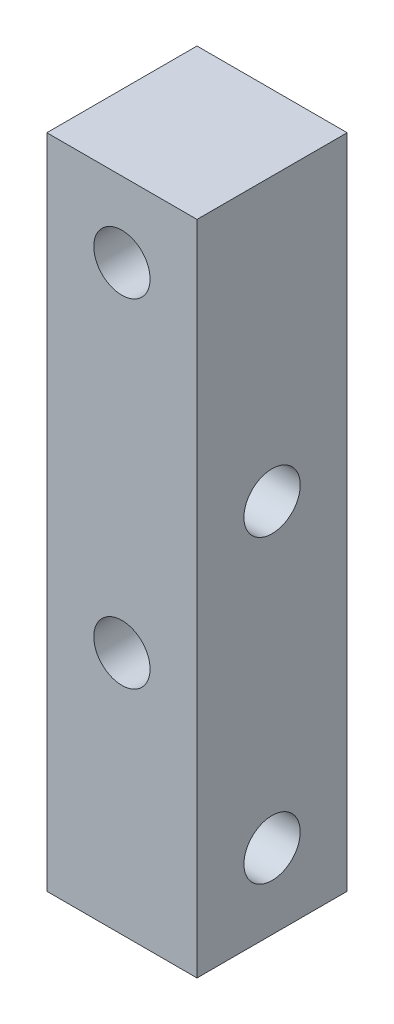
ISO-10303-21;
HEADER;
FILE_DESCRIPTION(('STEP AP214'),'2;1');
FILE_NAME('part.step','',(''),(''),'','','');
FILE_SCHEMA(('AUTOMOTIVE_DESIGN { 1 0 10303 214 1 1 1 1 }'));
ENDSEC;
DATA;
#1=APPLICATION_CONTEXT('core data for automotive mechanical design processes');
#2=APPLICATION_PROTOCOL_DEFINITION('international standard','automotive_design',2000,#1);
#3=PRODUCT_CONTEXT('',#1,'mechanical');
#4=PRODUCT('Part','Part','',(#3));
#5=PRODUCT_RELATED_PRODUCT_CATEGORY('part','',(#4));
#6=PRODUCT_DEFINITION_FORMATION('','',#4);
#7=PRODUCT_DEFINITION_CONTEXT('part definition',#1,'design');
#8=PRODUCT_DEFINITION('design','',#6,#7);
#9=PRODUCT_DEFINITION_SHAPE('','',#8);
#10=(LENGTH_UNIT() NAMED_UNIT(*) SI_UNIT(.MILLI.,.METRE.));
#11=(NAMED_UNIT(*) PLANE_ANGLE_UNIT() SI_UNIT($,.RADIAN.));
#12=(NAMED_UNIT(*) SI_UNIT($,.STERADIAN.) SOLID_ANGLE_UNIT());
#13=UNCERTAINTY_MEASURE_WITH_UNIT(LENGTH_MEASURE(1.E-05),#10,'distance_accuracy_value','');
#14=(GEOMETRIC_REPRESENTATION_CONTEXT(3) GLOBAL_UNCERTAINTY_ASSIGNED_CONTEXT((#13)) GLOBAL_UNIT_ASSIGNED_CONTEXT((#10,
#11,#12)) REPRESENTATION_CONTEXT('',''));
#15=CARTESIAN_POINT('',(0.,0.,0.));
#16=DIRECTION('',(0.,0.,1.));
#17=DIRECTION('',(1.,0.,0.));
#18=AXIS2_PLACEMENT_3D('',#15,#16,#17);
#19=CARTESIAN_POINT('',(4.,35.,-4.));
#20=DIRECTION('',(-1.,0.,0.));
#21=DIRECTION('',(0.,0.,1.));
#22=AXIS2_PLACEMENT_3D('',#19,#20,#21);
#23=PLANE('',#22);
#24=CARTESIAN_POINT('',(4.,20.,0.));
#25=DIRECTION('',(1.,0.,0.));
#26=DIRECTION('',(0.,0.,-1.));
#27=AXIS2_PLACEMENT_3D('',#24,#25,#26);
#28=CIRCLE('',#27,1.5);
#29=CARTESIAN_POINT('',(4.,20.,-1.5));
#30=VERTEX_POINT('',#29);
#31=EDGE_CURVE('E140',#30,#30,#28,.T.);
#32=ORIENTED_EDGE('',*,*,#31,.F.);
#33=EDGE_LOOP('',(#32));
#34=FACE_BOUND('',#33,.T.);
#35=CARTESIAN_POINT('',(4.,4.,0.));
#36=DIRECTION('',(1.,0.,0.));
#37=DIRECTION('',(0.,0.,-1.));
#38=AXIS2_PLACEMENT_3D('',#35,#36,#37);
#39=CIRCLE('',#38,1.5);
#40=CARTESIAN_POINT('',(4.,4.,-1.5));
#41=VERTEX_POINT('',#40);
#42=EDGE_CURVE('E134',#41,#41,#39,.T.);
#43=ORIENTED_EDGE('',*,*,#42,.F.);
#44=EDGE_LOOP('',(#43));
#45=FACE_BOUND('',#44,.T.);
#46=DIRECTION('',(0.,0.,-1.));
#47=VECTOR('',#46,1.);
#48=CARTESIAN_POINT('',(4.,0.,-4.));
#49=LINE('',#48,#47);
#50=CARTESIAN_POINT('',(4.,0.,4.));
#51=VERTEX_POINT('',#50);
#52=CARTESIAN_POINT('',(4.,0.,-4.));
#53=VERTEX_POINT('',#52);
#54=EDGE_CURVE('E108',#51,#53,#49,.T.);
#55=ORIENTED_EDGE('',*,*,#54,.T.);
#56=DIRECTION('',(0.,-1.,0.));
#57=VECTOR('',#56,1.);
#58=CARTESIAN_POINT('',(4.,35.,-4.));
#59=LINE('',#58,#57);
#60=CARTESIAN_POINT('',(4.,35.,-4.));
#61=VERTEX_POINT('',#60);
#62=EDGE_CURVE('E13',#61,#53,#59,.T.);
#63=ORIENTED_EDGE('',*,*,#62,.F.);
#64=DIRECTION('',(0.,0.,-1.));
#65=VECTOR('',#64,1.);
#66=CARTESIAN_POINT('',(4.,35.,-4.));
#67=LINE('',#66,#65);
#68=CARTESIAN_POINT('',(4.,35.,4.));
#69=VERTEX_POINT('',#68);
#70=EDGE_CURVE('E96',#69,#61,#67,.T.);
#71=ORIENTED_EDGE('',*,*,#70,.F.);
#72=DIRECTION('',(0.,-1.,0.));
#73=VECTOR('',#72,1.);
#74=CARTESIAN_POINT('',(4.,35.,4.));
#75=LINE('',#74,#73);
#76=EDGE_CURVE('E104',#69,#51,#75,.T.);
#77=ORIENTED_EDGE('',*,*,#76,.T.);
#78=EDGE_LOOP('',(#55,#63,#71,#77));
#79=FACE_BOUND('',#78,.T.);
#80=ADVANCED_FACE('F45',(#34,#45,#79),#23,.F.);
#81=CARTESIAN_POINT('',(-4.,35.,-4.));
#82=DIRECTION('',(0.,0.,1.));
#83=DIRECTION('',(1.,0.,0.));
#84=AXIS2_PLACEMENT_3D('',#81,#82,#83);
#85=PLANE('',#84);
#86=CARTESIAN_POINT('',(0.,31.,-4.));
#87=DIRECTION('',(0.,0.,-1.));
#88=DIRECTION('',(-1.,0.,0.));
#89=AXIS2_PLACEMENT_3D('',#86,#87,#88);
#90=CIRCLE('',#89,1.5);
#91=CARTESIAN_POINT('',(-1.5,31.,-4.));
#92=VERTEX_POINT('',#91);
#93=EDGE_CURVE('E129',#92,#92,#90,.T.);
#94=ORIENTED_EDGE('',*,*,#93,.F.);
#95=EDGE_LOOP('',(#94));
#96=FACE_BOUND('',#95,.T.);
#97=CARTESIAN_POINT('',(0.,13.,-4.));
#98=DIRECTION('',(0.,0.,-1.));
#99=DIRECTION('',(-1.,0.,0.));
#100=AXIS2_PLACEMENT_3D('',#97,#98,#99);
#101=CIRCLE('',#100,1.5);
#102=CARTESIAN_POINT('',(-1.5,13.,-4.));
#103=VERTEX_POINT('',#102);
#104=EDGE_CURVE('E122',#103,#103,#101,.T.);
#105=ORIENTED_EDGE('',*,*,#104,.F.);
#106=EDGE_LOOP('',(#105));
#107=FACE_BOUND('',#106,.T.);
#108=DIRECTION('',(-1.,0.,0.));
#109=VECTOR('',#108,1.);
#110=CARTESIAN_POINT('',(-4.,0.,-4.));
#111=LINE('',#110,#109);
#112=CARTESIAN_POINT('',(-4.,0.,-4.));
#113=VERTEX_POINT('',#112);
#114=EDGE_CURVE('E100',#53,#113,#111,.T.);
#115=ORIENTED_EDGE('',*,*,#114,.T.);
#116=DIRECTION('',(0.,-1.,0.));
#117=VECTOR('',#116,1.);
#118=CARTESIAN_POINT('',(-4.,35.,-4.));
#119=LINE('',#118,#117);
#120=CARTESIAN_POINT('',(-4.,35.,-4.));
#121=VERTEX_POINT('',#120);
#122=EDGE_CURVE('E53',#121,#113,#119,.T.);
#123=ORIENTED_EDGE('',*,*,#122,.F.);
#124=DIRECTION('',(-1.,0.,0.));
#125=VECTOR('',#124,1.);
#126=CARTESIAN_POINT('',(-4.,35.,-4.));
#127=LINE('',#126,#125);
#128=EDGE_CURVE('E91',#61,#121,#127,.T.);
#129=ORIENTED_EDGE('',*,*,#128,.F.);
#130=ORIENTED_EDGE('',*,*,#62,.T.);
#131=EDGE_LOOP('',(#115,#123,#129,#130));
#132=FACE_BOUND('',#131,.T.);
#133=ADVANCED_FACE('F99',(#96,#107,#132),#85,.F.);
#134=CARTESIAN_POINT('',(-4.,35.,-4.));
#135=DIRECTION('',(1.,0.,0.));
#136=DIRECTION('',(0.,0.,-1.));
#137=AXIS2_PLACEMENT_3D('',#134,#135,#136);
#138=PLANE('',#137);
#139=CARTESIAN_POINT('',(-4.,20.,0.));
#140=DIRECTION('',(1.,0.,0.));
#141=DIRECTION('',(0.,0.,-1.));
#142=AXIS2_PLACEMENT_3D('',#139,#140,#141);
#143=CIRCLE('',#142,1.5);
#144=CARTESIAN_POINT('',(-4.,20.,-1.5));
#145=VERTEX_POINT('',#144);
#146=EDGE_CURVE('E126',#145,#145,#143,.T.);
#147=ORIENTED_EDGE('',*,*,#146,.T.);
#148=EDGE_LOOP('',(#147));
#149=FACE_BOUND('',#148,.T.);
#150=CARTESIAN_POINT('',(-4.,4.,0.));
#151=DIRECTION('',(1.,0.,0.));
#152=DIRECTION('',(0.,0.,-1.));
#153=AXIS2_PLACEMENT_3D('',#150,#151,#152);
#154=CIRCLE('',#153,1.5);
#155=CARTESIAN_POINT('',(-4.,4.,-1.5));
#156=VERTEX_POINT('',#155);
#157=EDGE_CURVE('E137',#156,#156,#154,.T.);
#158=ORIENTED_EDGE('',*,*,#157,.T.);
#159=EDGE_LOOP('',(#158));
#160=FACE_BOUND('',#159,.T.);
#161=DIRECTION('',(0.,0.,1.));
#162=VECTOR('',#161,1.);
#163=CARTESIAN_POINT('',(-4.,0.,-4.));
#164=LINE('',#163,#162);
#165=CARTESIAN_POINT('',(-4.,0.,4.));
#166=VERTEX_POINT('',#165);
#167=EDGE_CURVE('E78',#113,#166,#164,.T.);
#168=ORIENTED_EDGE('',*,*,#167,.T.);
#169=DIRECTION('',(0.,-1.,0.));
#170=VECTOR('',#169,1.);
#171=CARTESIAN_POINT('',(-4.,35.,4.));
#172=LINE('',#171,#170);
#173=CARTESIAN_POINT('',(-4.,35.,4.));
#174=VERTEX_POINT('',#173);
#175=EDGE_CURVE('E101',#174,#166,#172,.T.);
#176=ORIENTED_EDGE('',*,*,#175,.F.);
#177=DIRECTION('',(0.,0.,1.));
#178=VECTOR('',#177,1.);
#179=CARTESIAN_POINT('',(-4.,35.,-4.));
#180=LINE('',#179,#178);
#181=EDGE_CURVE('E94',#121,#174,#180,.T.);
#182=ORIENTED_EDGE('',*,*,#181,.F.);
#183=ORIENTED_EDGE('',*,*,#122,.T.);
#184=EDGE_LOOP('',(#168,#176,#182,#183));
#185=FACE_BOUND('',#184,.T.);
#186=ADVANCED_FACE('F102',(#149,#160,#185),#138,.F.);
#187=CARTESIAN_POINT('',(-4.,35.,4.));
#188=DIRECTION('',(0.,0.,-1.));
#189=DIRECTION('',(-1.,0.,0.));
#190=AXIS2_PLACEMENT_3D('',#187,#188,#189);
#191=PLANE('',#190);
#192=CARTESIAN_POINT('',(0.,31.,4.));
#193=DIRECTION('',(0.,0.,-1.));
#194=DIRECTION('',(-1.,0.,0.));
#195=AXIS2_PLACEMENT_3D('',#192,#193,#194);
#196=CIRCLE('',#195,1.5);
#197=CARTESIAN_POINT('',(-1.5,31.,4.));
#198=VERTEX_POINT('',#197);
#199=EDGE_CURVE('E111',#198,#198,#196,.T.);
#200=ORIENTED_EDGE('',*,*,#199,.T.);
#201=EDGE_LOOP('',(#200));
#202=FACE_BOUND('',#201,.T.);
#203=CARTESIAN_POINT('',(0.,13.,4.));
#204=DIRECTION('',(0.,0.,-1.));
#205=DIRECTION('',(-1.,0.,0.));
#206=AXIS2_PLACEMENT_3D('',#203,#204,#205);
#207=CIRCLE('',#206,1.5);
#208=CARTESIAN_POINT('',(-1.5,13.,4.));
#209=VERTEX_POINT('',#208);
#210=EDGE_CURVE('E125',#209,#209,#207,.T.);
#211=ORIENTED_EDGE('',*,*,#210,.T.);
#212=EDGE_LOOP('',(#211));
#213=FACE_BOUND('',#212,.T.);
#214=DIRECTION('',(1.,0.,0.));
#215=VECTOR('',#214,1.);
#216=CARTESIAN_POINT('',(-4.,0.,4.));
#217=LINE('',#216,#215);
#218=EDGE_CURVE('E84',#166,#51,#217,.T.);
#219=ORIENTED_EDGE('',*,*,#218,.T.);
#220=ORIENTED_EDGE('',*,*,#76,.F.);
#221=DIRECTION('',(1.,0.,0.));
#222=VECTOR('',#221,1.);
#223=CARTESIAN_POINT('',(-4.,35.,4.));
#224=LINE('',#223,#222);
#225=EDGE_CURVE('E61',#174,#69,#224,.T.);
#226=ORIENTED_EDGE('',*,*,#225,.F.);
#227=ORIENTED_EDGE('',*,*,#175,.T.);
#228=EDGE_LOOP('',(#219,#220,#226,#227));
#229=FACE_BOUND('',#228,.T.);
#230=ADVANCED_FACE('F116',(#202,#213,#229),#191,.F.);
#231=CARTESIAN_POINT('',(0.,35.,0.));
#232=DIRECTION('',(0.,1.,0.));
#233=DIRECTION('',(0.,0.,1.));
#234=AXIS2_PLACEMENT_3D('',#231,#232,#233);
#235=PLANE('',#234);
#236=ORIENTED_EDGE('',*,*,#70,.T.);
#237=ORIENTED_EDGE('',*,*,#128,.T.);
#238=ORIENTED_EDGE('',*,*,#181,.T.);
#239=ORIENTED_EDGE('',*,*,#225,.T.);
#240=EDGE_LOOP('',(#236,#237,#238,#239));
#241=FACE_BOUND('',#240,.T.);
#242=ADVANCED_FACE('F92',(#241),#235,.T.);
#243=CARTESIAN_POINT('',(0.,0.,0.));
#244=DIRECTION('',(0.,1.,0.));
#245=DIRECTION('',(0.,0.,1.));
#246=AXIS2_PLACEMENT_3D('',#243,#244,#245);
#247=PLANE('',#246);
#248=ORIENTED_EDGE('',*,*,#54,.F.);
#249=ORIENTED_EDGE('',*,*,#218,.F.);
#250=ORIENTED_EDGE('',*,*,#167,.F.);
#251=ORIENTED_EDGE('',*,*,#114,.F.);
#252=EDGE_LOOP('',(#248,#249,#250,#251));
#253=FACE_BOUND('',#252,.T.);
#254=ADVANCED_FACE('F119',(#253),#247,.F.);
#255=CARTESIAN_POINT('',(0.,13.,4.));
#256=DIRECTION('',(0.,0.,-1.));
#257=DIRECTION('',(-1.,0.,0.));
#258=AXIS2_PLACEMENT_3D('',#255,#256,#257);
#259=CYLINDRICAL_SURFACE('',#258,1.5);
#260=ORIENTED_EDGE('',*,*,#210,.F.);
#261=EDGE_LOOP('',(#260));
#262=FACE_BOUND('',#261,.T.);
#263=ORIENTED_EDGE('',*,*,#104,.T.);
#264=EDGE_LOOP('',(#263));
#265=FACE_BOUND('',#264,.T.);
#266=ADVANCED_FACE('F166',(#262,#265),#259,.F.);
#267=CARTESIAN_POINT('',(0.,31.,4.));
#268=DIRECTION('',(0.,0.,-1.));
#269=DIRECTION('',(-1.,0.,0.));
#270=AXIS2_PLACEMENT_3D('',#267,#268,#269);
#271=CYLINDRICAL_SURFACE('',#270,1.5);
#272=ORIENTED_EDGE('',*,*,#199,.F.);
#273=EDGE_LOOP('',(#272));
#274=FACE_BOUND('',#273,.T.);
#275=ORIENTED_EDGE('',*,*,#93,.T.);
#276=EDGE_LOOP('',(#275));
#277=FACE_BOUND('',#276,.T.);
#278=ADVANCED_FACE('F160',(#274,#277),#271,.F.);
#279=CARTESIAN_POINT('',(-4.,4.,0.));
#280=DIRECTION('',(1.,0.,0.));
#281=DIRECTION('',(0.,0.,-1.));
#282=AXIS2_PLACEMENT_3D('',#279,#280,#281);
#283=CYLINDRICAL_SURFACE('',#282,1.5);
#284=ORIENTED_EDGE('',*,*,#157,.F.);
#285=EDGE_LOOP('',(#284));
#286=FACE_BOUND('',#285,.T.);
#287=ORIENTED_EDGE('',*,*,#42,.T.);
#288=EDGE_LOOP('',(#287));
#289=FACE_BOUND('',#288,.T.);
#290=ADVANCED_FACE('F151',(#286,#289),#283,.F.);
#291=CARTESIAN_POINT('',(-4.,20.,0.));
#292=DIRECTION('',(1.,0.,0.));
#293=DIRECTION('',(0.,0.,-1.));
#294=AXIS2_PLACEMENT_3D('',#291,#292,#293);
#295=CYLINDRICAL_SURFACE('',#294,1.5);
#296=ORIENTED_EDGE('',*,*,#146,.F.);
#297=EDGE_LOOP('',(#296));
#298=FACE_BOUND('',#297,.T.);
#299=ORIENTED_EDGE('',*,*,#31,.T.);
#300=EDGE_LOOP('',(#299));
#301=FACE_BOUND('',#300,.T.);
#302=ADVANCED_FACE('F148',(#298,#301),#295,.F.);
#303=CLOSED_SHELL('',(#80,#133,#186,#230,#242,#254,#266,#278,#290,#302));
#304=MANIFOLD_SOLID_BREP('B2',#303);
#305=ADVANCED_BREP_SHAPE_REPRESENTATION('',(#18,#304),#14);
#306=SHAPE_DEFINITION_REPRESENTATION(#9,#305);
ENDSEC;
END-ISO-10303-21;
